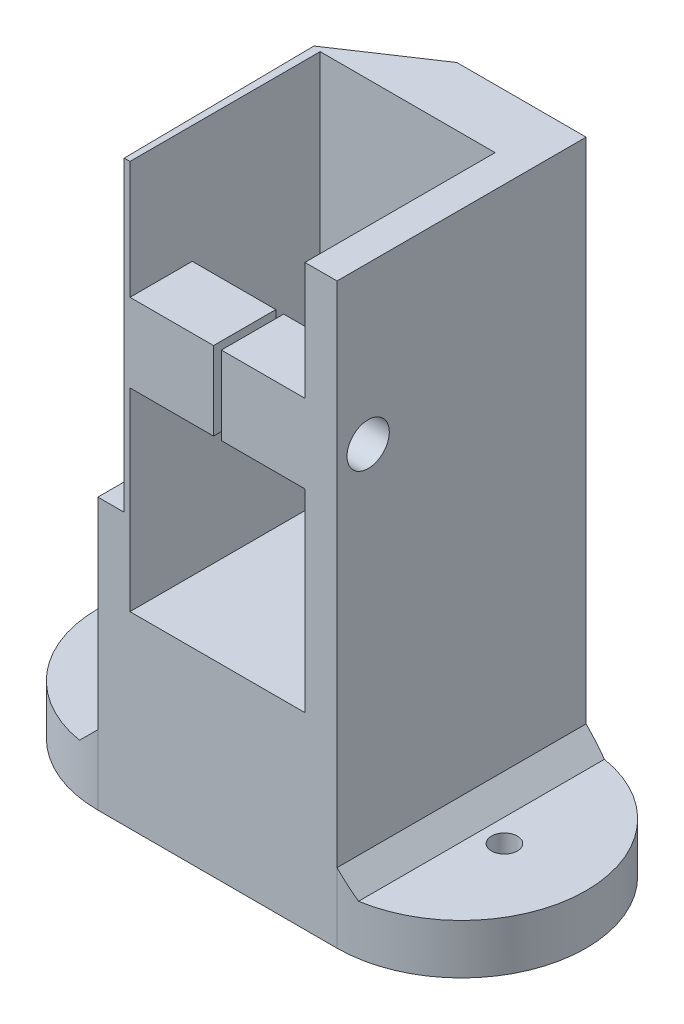
ISO-10303-21;
HEADER;
FILE_DESCRIPTION(('STEP AP214'),'2;1');
FILE_NAME('part.step','',(''),(''),'','','');
FILE_SCHEMA(('AUTOMOTIVE_DESIGN { 1 0 10303 214 1 1 1 1 }'));
ENDSEC;
DATA;
#1=APPLICATION_CONTEXT('core data for automotive mechanical design processes');
#2=APPLICATION_PROTOCOL_DEFINITION('international standard','automotive_design',2000,#1);
#3=PRODUCT_CONTEXT('',#1,'mechanical');
#4=PRODUCT('Part','Part','',(#3));
#5=PRODUCT_RELATED_PRODUCT_CATEGORY('part','',(#4));
#6=PRODUCT_DEFINITION_FORMATION('','',#4);
#7=PRODUCT_DEFINITION_CONTEXT('part definition',#1,'design');
#8=PRODUCT_DEFINITION('design','',#6,#7);
#9=PRODUCT_DEFINITION_SHAPE('','',#8);
#10=(LENGTH_UNIT() NAMED_UNIT(*) SI_UNIT(.MILLI.,.METRE.));
#11=(NAMED_UNIT(*) PLANE_ANGLE_UNIT() SI_UNIT($,.RADIAN.));
#12=(NAMED_UNIT(*) SI_UNIT($,.STERADIAN.) SOLID_ANGLE_UNIT());
#13=UNCERTAINTY_MEASURE_WITH_UNIT(LENGTH_MEASURE(1.E-05),#10,'distance_accuracy_value','');
#14=(GEOMETRIC_REPRESENTATION_CONTEXT(3) GLOBAL_UNCERTAINTY_ASSIGNED_CONTEXT((#13)) GLOBAL_UNIT_ASSIGNED_CONTEXT((#10,
#11,#12)) REPRESENTATION_CONTEXT('',''));
#15=CARTESIAN_POINT('',(0.,0.,0.));
#16=DIRECTION('',(0.,0.,1.));
#17=DIRECTION('',(1.,0.,0.));
#18=AXIS2_PLACEMENT_3D('',#15,#16,#17);
#19=CARTESIAN_POINT('',(0.,73.66,0.));
#20=DIRECTION('',(-1.,0.,0.));
#21=DIRECTION('',(0.,0.,1.));
#22=AXIS2_PLACEMENT_3D('',#19,#20,#21);
#23=PLANE('',#22);
#24=DIRECTION('',(0.,-1.,0.));
#25=VECTOR('',#24,1.);
#26=CARTESIAN_POINT('',(0.,73.66,0.));
#27=LINE('',#26,#25);
#28=CARTESIAN_POINT('',(0.,34.56,0.));
#29=VERTEX_POINT('',#28);
#30=CARTESIAN_POINT('',(0.,8.89,0.));
#31=VERTEX_POINT('',#30);
#32=EDGE_CURVE('E396',#29,#31,#27,.T.);
#33=ORIENTED_EDGE('',*,*,#32,.F.);
#34=DIRECTION('',(0.,0.,-1.));
#35=VECTOR('',#34,1.);
#36=CARTESIAN_POINT('',(0.,34.56,0.));
#37=LINE('',#36,#35);
#38=CARTESIAN_POINT('',(0.,34.56,-31.75));
#39=VERTEX_POINT('',#38);
#40=EDGE_CURVE('E11',#29,#39,#37,.T.);
#41=ORIENTED_EDGE('',*,*,#40,.T.);
#42=DIRECTION('',(0.,-1.,0.));
#43=VECTOR('',#42,1.);
#44=CARTESIAN_POINT('',(0.,73.66,-31.75));
#45=LINE('',#44,#43);
#46=CARTESIAN_POINT('',(0.,8.89,-31.75));
#47=VERTEX_POINT('',#46);
#48=EDGE_CURVE('E231',#39,#47,#45,.T.);
#49=ORIENTED_EDGE('',*,*,#48,.T.);
#50=DIRECTION('',(0.,0.,1.));
#51=VECTOR('',#50,1.);
#52=CARTESIAN_POINT('',(0.,8.89,0.));
#53=LINE('',#52,#51);
#54=EDGE_CURVE('E339',#47,#31,#53,.T.);
#55=ORIENTED_EDGE('',*,*,#54,.T.);
#56=EDGE_LOOP('',(#33,#41,#49,#55));
#57=FACE_BOUND('',#56,.T.);
#58=ADVANCED_FACE('F17',(#57),#23,.T.);
#59=CARTESIAN_POINT('',(0.,73.66,0.));
#60=DIRECTION('',(0.,1.,0.));
#61=DIRECTION('',(0.,0.,1.));
#62=AXIS2_PLACEMENT_3D('',#59,#60,#61);
#63=PLANE('',#62);
#64=DIRECTION('',(1.,0.,0.));
#65=VECTOR('',#64,1.);
#66=CARTESIAN_POINT('',(0.,73.66,-31.75));
#67=LINE('',#66,#65);
#68=CARTESIAN_POINT('',(14.0035822987556,73.66,-31.75));
#69=VERTEX_POINT('',#68);
#70=CARTESIAN_POINT('',(30.48,73.66,-31.75));
#71=VERTEX_POINT('',#70);
#72=EDGE_CURVE('E347',#69,#71,#67,.T.);
#73=ORIENTED_EDGE('',*,*,#72,.F.);
#74=DIRECTION('',(-0.832036943666449,0.,0.554720221710183));
#75=VECTOR('',#74,1.);
#76=CARTESIAN_POINT('',(8.53831481132242,73.66,-28.1062983405821));
#77=LINE('',#76,#75);
#78=CARTESIAN_POINT('',(3.0730473238892,73.66,-24.4625966811642));
#79=VERTEX_POINT('',#78);
#80=EDGE_CURVE('E215',#69,#79,#77,.T.);
#81=ORIENTED_EDGE('',*,*,#80,.T.);
#82=DIRECTION('',(-0.0116010565162885,0.,-0.999932705479577));
#83=VECTOR('',#82,1.);
#84=CARTESIAN_POINT('',(3.21495285667065,73.66,-12.2312983405821));
#85=LINE('',#84,#83);
#86=CARTESIAN_POINT('',(3.3568583894521,73.66,0.));
#87=VERTEX_POINT('',#86);
#88=EDGE_CURVE('E513',#87,#79,#85,.T.);
#89=ORIENTED_EDGE('',*,*,#88,.F.);
#90=DIRECTION('',(1.,0.,0.));
#91=VECTOR('',#90,1.);
#92=CARTESIAN_POINT('',(0.,73.66,0.));
#93=LINE('',#92,#91);
#94=CARTESIAN_POINT('',(4.09,73.66,0.));
#95=VERTEX_POINT('',#94);
#96=EDGE_CURVE('E399',#87,#95,#93,.T.);
#97=ORIENTED_EDGE('',*,*,#96,.T.);
#98=DIRECTION('',(0.,0.,1.));
#99=VECTOR('',#98,1.);
#100=CARTESIAN_POINT('',(4.09,73.66,-24.240000034));
#101=LINE('',#100,#99);
#102=CARTESIAN_POINT('',(4.09,73.66,-24.240000034));
#103=VERTEX_POINT('',#102);
#104=EDGE_CURVE('E476',#103,#95,#101,.T.);
#105=ORIENTED_EDGE('',*,*,#104,.F.);
#106=DIRECTION('',(-1.,0.,0.));
#107=VECTOR('',#106,1.);
#108=CARTESIAN_POINT('',(4.09,73.66,-24.240000034));
#109=LINE('',#108,#107);
#110=CARTESIAN_POINT('',(26.39,73.66,-24.240000034));
#111=VERTEX_POINT('',#110);
#112=EDGE_CURVE('E335',#111,#103,#109,.T.);
#113=ORIENTED_EDGE('',*,*,#112,.F.);
#114=DIRECTION('',(0.,0.,1.));
#115=VECTOR('',#114,1.);
#116=CARTESIAN_POINT('',(26.39,73.66,-24.240000034));
#117=LINE('',#116,#115);
#118=CARTESIAN_POINT('',(26.39,73.66,0.));
#119=VERTEX_POINT('',#118);
#120=EDGE_CURVE('E331',#111,#119,#117,.T.);
#121=ORIENTED_EDGE('',*,*,#120,.T.);
#122=CARTESIAN_POINT('',(30.48,73.66,0.));
#123=VERTEX_POINT('',#122);
#124=EDGE_CURVE('E392',#119,#123,#93,.T.);
#125=ORIENTED_EDGE('',*,*,#124,.T.);
#126=DIRECTION('',(0.,0.,-1.));
#127=VECTOR('',#126,1.);
#128=CARTESIAN_POINT('',(30.48,73.66,0.));
#129=LINE('',#128,#127);
#130=EDGE_CURVE('E356',#123,#71,#129,.T.);
#131=ORIENTED_EDGE('',*,*,#130,.T.);
#132=EDGE_LOOP('',(#73,#81,#89,#97,#105,#113,#121,#125,#131));
#133=FACE_BOUND('',#132,.T.);
#134=ADVANCED_FACE('F509',(#133),#63,.T.);
#135=CARTESIAN_POINT('',(4.09,73.66,-24.240000034));
#136=DIRECTION('',(-1.,0.,0.));
#137=DIRECTION('',(0.,-1.,0.));
#138=AXIS2_PLACEMENT_3D('',#135,#136,#137);
#139=PLANE('',#138);
#140=DIRECTION('',(0.,0.,-1.));
#141=VECTOR('',#140,1.);
#142=CARTESIAN_POINT('',(4.09,48.66,0.));
#143=LINE('',#142,#141);
#144=CARTESIAN_POINT('',(4.09,48.66,0.));
#145=VERTEX_POINT('',#144);
#146=CARTESIAN_POINT('',(4.09,48.66,-7.940000122));
#147=VERTEX_POINT('',#146);
#148=EDGE_CURVE('E25',#145,#147,#143,.T.);
#149=ORIENTED_EDGE('',*,*,#148,.F.);
#150=DIRECTION('',(0.,-1.,0.));
#151=VECTOR('',#150,1.);
#152=CARTESIAN_POINT('',(4.09,73.66,0.));
#153=LINE('',#152,#151);
#154=CARTESIAN_POINT('',(4.09,23.960000086,0.));
#155=VERTEX_POINT('',#154);
#156=EDGE_CURVE('E488',#145,#155,#153,.T.);
#157=ORIENTED_EDGE('',*,*,#156,.T.);
#158=DIRECTION('',(0.,0.,1.));
#159=VECTOR('',#158,1.);
#160=CARTESIAN_POINT('',(4.09,23.960000086,-24.240000034));
#161=LINE('',#160,#159);
#162=CARTESIAN_POINT('',(4.09,23.960000086,-24.240000034));
#163=VERTEX_POINT('',#162);
#164=EDGE_CURVE('E484',#163,#155,#161,.T.);
#165=ORIENTED_EDGE('',*,*,#164,.F.);
#166=DIRECTION('',(0.,-1.,0.));
#167=VECTOR('',#166,1.);
#168=CARTESIAN_POINT('',(4.09,73.66,-24.240000034));
#169=LINE('',#168,#167);
#170=EDGE_CURVE('E480',#103,#163,#169,.T.);
#171=ORIENTED_EDGE('',*,*,#170,.F.);
#172=ORIENTED_EDGE('',*,*,#104,.T.);
#173=CARTESIAN_POINT('',(4.09,58.66,0.));
#174=VERTEX_POINT('',#173);
#175=EDGE_CURVE('E475',#95,#174,#153,.T.);
#176=ORIENTED_EDGE('',*,*,#175,.T.);
#177=DIRECTION('',(0.,0.,1.));
#178=VECTOR('',#177,1.);
#179=CARTESIAN_POINT('',(4.09,58.66,0.));
#180=LINE('',#179,#178);
#181=CARTESIAN_POINT('',(4.09,58.66,-7.940000122));
#182=VERTEX_POINT('',#181);
#183=EDGE_CURVE('E471',#182,#174,#180,.T.);
#184=ORIENTED_EDGE('',*,*,#183,.F.);
#185=DIRECTION('',(0.,1.,0.));
#186=VECTOR('',#185,1.);
#187=CARTESIAN_POINT('',(4.09,58.66,-7.940000122));
#188=LINE('',#187,#186);
#189=EDGE_CURVE('E467',#147,#182,#188,.T.);
#190=ORIENTED_EDGE('',*,*,#189,.F.);
#191=EDGE_LOOP('',(#149,#157,#165,#171,#172,#176,#184,#190));
#192=FACE_BOUND('',#191,.T.);
#193=ADVANCED_FACE('F19',(#192),#139,.F.);
#194=CARTESIAN_POINT('',(0.,6.35,-15.875));
#195=DIRECTION('',(0.,-1.,0.));
#196=DIRECTION('',(0.,0.,-1.));
#197=AXIS2_PLACEMENT_3D('',#194,#195,#196);
#198=CYLINDRICAL_SURFACE('',#197,15.875);
#199=CARTESIAN_POINT('',(0.,0.,-15.875));
#200=DIRECTION('',(0.,1.,0.));
#201=DIRECTION('',(0.,0.,1.));
#202=AXIS2_PLACEMENT_3D('',#199,#200,#201);
#203=CIRCLE('',#202,15.875);
#204=CARTESIAN_POINT('',(0.,0.,0.));
#205=VERTEX_POINT('',#204);
#206=CARTESIAN_POINT('',(0.,0.,-31.75));
#207=VERTEX_POINT('',#206);
#208=EDGE_CURVE('E463',#205,#207,#203,.F.);
#209=ORIENTED_EDGE('',*,*,#208,.F.);
#210=DIRECTION('',(0.,-1.,0.));
#211=VECTOR('',#210,1.);
#212=CARTESIAN_POINT('',(0.,6.35,0.));
#213=LINE('',#212,#211);
#214=EDGE_CURVE('E459',#31,#205,#213,.T.);
#215=ORIENTED_EDGE('',*,*,#214,.F.);
#216=CARTESIAN_POINT('',(0.,8.89,-15.875));
#217=DIRECTION('',(-0.707106781186545,0.70710678118655,0.));
#218=DIRECTION('',(-0.70710678118655,-0.707106781186545,0.));
#219=AXIS2_PLACEMENT_3D('',#216,#217,#218);
#220=ELLIPSE('',#219,22.4506403026728,15.875);
#221=CARTESIAN_POINT('',(-2.54,6.35,-0.20451739734861));
#222=VERTEX_POINT('',#221);
#223=EDGE_CURVE('E456',#31,#222,#220,.F.);
#224=ORIENTED_EDGE('',*,*,#223,.T.);
#225=CARTESIAN_POINT('',(0.,6.35,-15.875));
#226=DIRECTION('',(0.,1.,0.));
#227=DIRECTION('',(0.,0.,1.));
#228=AXIS2_PLACEMENT_3D('',#225,#226,#227);
#229=CIRCLE('',#228,15.875);
#230=CARTESIAN_POINT('',(-2.54,6.35,-31.5454826026514));
#231=VERTEX_POINT('',#230);
#232=EDGE_CURVE('E453',#222,#231,#229,.F.);
#233=ORIENTED_EDGE('',*,*,#232,.T.);
#234=CARTESIAN_POINT('',(0.,8.89,-15.875));
#235=DIRECTION('',(-0.707106781186545,0.70710678118655,0.));
#236=DIRECTION('',(-0.70710678118655,-0.707106781186545,0.));
#237=AXIS2_PLACEMENT_3D('',#234,#235,#236);
#238=ELLIPSE('',#237,22.4506403026728,15.875);
#239=EDGE_CURVE('E449',#231,#47,#238,.F.);
#240=ORIENTED_EDGE('',*,*,#239,.T.);
#241=DIRECTION('',(0.,-1.,0.));
#242=VECTOR('',#241,1.);
#243=CARTESIAN_POINT('',(0.,6.35,-31.75));
#244=LINE('',#243,#242);
#245=EDGE_CURVE('E446',#47,#207,#244,.T.);
#246=ORIENTED_EDGE('',*,*,#245,.T.);
#247=EDGE_LOOP('',(#209,#215,#224,#233,#240,#246));
#248=FACE_BOUND('',#247,.T.);
#249=ADVANCED_FACE('F559',(#248),#198,.T.);
#250=CARTESIAN_POINT('',(-5.461,6.35,-15.875));
#251=DIRECTION('',(0.,-1.,0.));
#252=DIRECTION('',(0.,0.,-1.));
#253=AXIS2_PLACEMENT_3D('',#250,#251,#252);
#254=CYLINDRICAL_SURFACE('',#253,1.651);
#255=CARTESIAN_POINT('',(-5.461,6.35,-15.875));
#256=DIRECTION('',(0.,1.,0.));
#257=DIRECTION('',(0.,0.,1.));
#258=AXIS2_PLACEMENT_3D('',#255,#256,#257);
#259=CIRCLE('',#258,1.651);
#260=CARTESIAN_POINT('',(-5.461,6.35,-14.224));
#261=VERTEX_POINT('',#260);
#262=EDGE_CURVE('E442',#261,#261,#259,.T.);
#263=ORIENTED_EDGE('',*,*,#262,.T.);
#264=EDGE_LOOP('',(#263));
#265=FACE_BOUND('',#264,.T.);
#266=CARTESIAN_POINT('',(-5.461,0.,-15.875));
#267=DIRECTION('',(0.,1.,0.));
#268=DIRECTION('',(0.,0.,1.));
#269=AXIS2_PLACEMENT_3D('',#266,#267,#268);
#270=CIRCLE('',#269,1.651);
#271=CARTESIAN_POINT('',(-5.461,0.,-14.224));
#272=VERTEX_POINT('',#271);
#273=EDGE_CURVE('E438',#272,#272,#270,.T.);
#274=ORIENTED_EDGE('',*,*,#273,.F.);
#275=EDGE_LOOP('',(#274));
#276=FACE_BOUND('',#275,.T.);
#277=ADVANCED_FACE('F569',(#265,#276),#254,.F.);
#278=CARTESIAN_POINT('',(0.,6.35,0.));
#279=DIRECTION('',(0.,1.,0.));
#280=DIRECTION('',(0.,0.,1.));
#281=AXIS2_PLACEMENT_3D('',#278,#279,#280);
#282=PLANE('',#281);
#283=ORIENTED_EDGE('',*,*,#262,.F.);
#284=EDGE_LOOP('',(#283));
#285=FACE_BOUND('',#284,.T.);
#286=ORIENTED_EDGE('',*,*,#232,.F.);
#287=DIRECTION('',(0.,0.,-1.));
#288=VECTOR('',#287,1.);
#289=CARTESIAN_POINT('',(-2.54,6.35,-31.75));
#290=LINE('',#289,#288);
#291=EDGE_CURVE('E434',#222,#231,#290,.T.);
#292=ORIENTED_EDGE('',*,*,#291,.T.);
#293=EDGE_LOOP('',(#286,#292));
#294=FACE_BOUND('',#293,.T.);
#295=ADVANCED_FACE('F580',(#285,#294),#282,.T.);
#296=CARTESIAN_POINT('',(0.,0.,0.));
#297=DIRECTION('',(0.,1.,0.));
#298=DIRECTION('',(0.,0.,1.));
#299=AXIS2_PLACEMENT_3D('',#296,#297,#298);
#300=PLANE('',#299);
#301=ORIENTED_EDGE('',*,*,#273,.T.);
#302=EDGE_LOOP('',(#301));
#303=FACE_BOUND('',#302,.T.);
#304=ORIENTED_EDGE('',*,*,#208,.T.);
#305=DIRECTION('',(1.,0.,0.));
#306=VECTOR('',#305,1.);
#307=CARTESIAN_POINT('',(0.,0.,-31.75));
#308=LINE('',#307,#306);
#309=CARTESIAN_POINT('',(30.48,0.,-31.75));
#310=VERTEX_POINT('',#309);
#311=EDGE_CURVE('E431',#207,#310,#308,.T.);
#312=ORIENTED_EDGE('',*,*,#311,.T.);
#313=CARTESIAN_POINT('',(30.48,0.,-15.875));
#314=DIRECTION('',(0.,1.,0.));
#315=DIRECTION('',(0.,0.,1.));
#316=AXIS2_PLACEMENT_3D('',#313,#314,#315);
#317=CIRCLE('',#316,15.875);
#318=CARTESIAN_POINT('',(30.48,0.,0.));
#319=VERTEX_POINT('',#318);
#320=EDGE_CURVE('E427',#319,#310,#317,.T.);
#321=ORIENTED_EDGE('',*,*,#320,.F.);
#322=DIRECTION('',(1.,0.,0.));
#323=VECTOR('',#322,1.);
#324=CARTESIAN_POINT('',(0.,0.,0.));
#325=LINE('',#324,#323);
#326=EDGE_CURVE('E423',#205,#319,#325,.T.);
#327=ORIENTED_EDGE('',*,*,#326,.F.);
#328=EDGE_LOOP('',(#304,#312,#321,#327));
#329=FACE_BOUND('',#328,.T.);
#330=CARTESIAN_POINT('',(35.941,0.,-15.875));
#331=DIRECTION('',(0.,1.,0.));
#332=DIRECTION('',(0.,0.,1.));
#333=AXIS2_PLACEMENT_3D('',#330,#331,#332);
#334=CIRCLE('',#333,1.651);
#335=CARTESIAN_POINT('',(35.941,0.,-14.224));
#336=VERTEX_POINT('',#335);
#337=EDGE_CURVE('E419',#336,#336,#334,.T.);
#338=ORIENTED_EDGE('',*,*,#337,.T.);
#339=EDGE_LOOP('',(#338));
#340=FACE_BOUND('',#339,.T.);
#341=ADVANCED_FACE('F592',(#303,#329,#340),#300,.F.);
#342=CARTESIAN_POINT('',(0.,73.66,0.));
#343=DIRECTION('',(0.,0.,-1.));
#344=DIRECTION('',(-1.,0.,0.));
#345=AXIS2_PLACEMENT_3D('',#342,#343,#344);
#346=PLANE('',#345);
#347=ORIENTED_EDGE('',*,*,#96,.F.);
#348=DIRECTION('',(0.,1.,0.));
#349=VECTOR('',#348,1.);
#350=CARTESIAN_POINT('',(3.3568583894521,34.56,0.));
#351=LINE('',#350,#349);
#352=CARTESIAN_POINT('',(3.3568583894521,34.56,0.));
#353=VERTEX_POINT('',#352);
#354=EDGE_CURVE('E219',#353,#87,#351,.T.);
#355=ORIENTED_EDGE('',*,*,#354,.F.);
#356=DIRECTION('',(1.,0.,0.));
#357=VECTOR('',#356,1.);
#358=CARTESIAN_POINT('',(0.,34.56,0.));
#359=LINE('',#358,#357);
#360=EDGE_CURVE('E232',#29,#353,#359,.T.);
#361=ORIENTED_EDGE('',*,*,#360,.F.);
#362=ORIENTED_EDGE('',*,*,#32,.T.);
#363=ORIENTED_EDGE('',*,*,#214,.T.);
#364=ORIENTED_EDGE('',*,*,#326,.T.);
#365=DIRECTION('',(0.,-1.,0.));
#366=VECTOR('',#365,1.);
#367=CARTESIAN_POINT('',(30.48,6.35,0.));
#368=LINE('',#367,#366);
#369=CARTESIAN_POINT('',(30.48,8.89,0.));
#370=VERTEX_POINT('',#369);
#371=EDGE_CURVE('E391',#370,#319,#368,.T.);
#372=ORIENTED_EDGE('',*,*,#371,.F.);
#373=DIRECTION('',(0.,-1.,0.));
#374=VECTOR('',#373,1.);
#375=CARTESIAN_POINT('',(30.48,73.66,0.));
#376=LINE('',#375,#374);
#377=EDGE_CURVE('E387',#123,#370,#376,.T.);
#378=ORIENTED_EDGE('',*,*,#377,.F.);
#379=ORIENTED_EDGE('',*,*,#124,.F.);
#380=DIRECTION('',(0.,1.,0.));
#381=VECTOR('',#380,1.);
#382=CARTESIAN_POINT('',(26.39,73.66,0.));
#383=LINE('',#382,#381);
#384=CARTESIAN_POINT('',(26.39,58.66,0.));
#385=VERTEX_POINT('',#384);
#386=EDGE_CURVE('E383',#385,#119,#383,.T.);
#387=ORIENTED_EDGE('',*,*,#386,.F.);
#388=DIRECTION('',(1.,0.,0.));
#389=VECTOR('',#388,1.);
#390=CARTESIAN_POINT('',(2.47114719572036,58.66,0.));
#391=LINE('',#390,#389);
#392=CARTESIAN_POINT('',(15.74,58.66,0.));
#393=VERTEX_POINT('',#392);
#394=EDGE_CURVE('E379',#393,#385,#391,.T.);
#395=ORIENTED_EDGE('',*,*,#394,.F.);
#396=DIRECTION('',(0.,1.,0.));
#397=VECTOR('',#396,1.);
#398=CARTESIAN_POINT('',(15.74,58.66,0.));
#399=LINE('',#398,#397);
#400=CARTESIAN_POINT('',(15.74,48.66,0.));
#401=VERTEX_POINT('',#400);
#402=EDGE_CURVE('E375',#401,#393,#399,.T.);
#403=ORIENTED_EDGE('',*,*,#402,.F.);
#404=DIRECTION('',(1.,0.,0.));
#405=VECTOR('',#404,1.);
#406=CARTESIAN_POINT('',(2.47114719572036,48.66,0.));
#407=LINE('',#406,#405);
#408=CARTESIAN_POINT('',(26.39,48.66,0.));
#409=VERTEX_POINT('',#408);
#410=EDGE_CURVE('E372',#401,#409,#407,.T.);
#411=ORIENTED_EDGE('',*,*,#410,.T.);
#412=CARTESIAN_POINT('',(26.39,23.960000086,0.));
#413=VERTEX_POINT('',#412);
#414=EDGE_CURVE('E371',#413,#409,#383,.T.);
#415=ORIENTED_EDGE('',*,*,#414,.F.);
#416=DIRECTION('',(1.,0.,0.));
#417=VECTOR('',#416,1.);
#418=CARTESIAN_POINT('',(4.09,23.960000086,0.));
#419=LINE('',#418,#417);
#420=EDGE_CURVE('E415',#155,#413,#419,.T.);
#421=ORIENTED_EDGE('',*,*,#420,.F.);
#422=ORIENTED_EDGE('',*,*,#156,.F.);
#423=DIRECTION('',(-1.,0.,0.));
#424=VECTOR('',#423,1.);
#425=CARTESIAN_POINT('',(28.0088528042796,48.66,0.));
#426=LINE('',#425,#424);
#427=CARTESIAN_POINT('',(14.74,48.66,0.));
#428=VERTEX_POINT('',#427);
#429=EDGE_CURVE('E411',#428,#145,#426,.T.);
#430=ORIENTED_EDGE('',*,*,#429,.F.);
#431=DIRECTION('',(0.,-1.,0.));
#432=VECTOR('',#431,1.);
#433=CARTESIAN_POINT('',(14.74,58.66,0.));
#434=LINE('',#433,#432);
#435=CARTESIAN_POINT('',(14.74,58.66,0.));
#436=VERTEX_POINT('',#435);
#437=EDGE_CURVE('E407',#436,#428,#434,.T.);
#438=ORIENTED_EDGE('',*,*,#437,.F.);
#439=DIRECTION('',(-1.,0.,0.));
#440=VECTOR('',#439,1.);
#441=CARTESIAN_POINT('',(28.0088528042796,58.66,0.));
#442=LINE('',#441,#440);
#443=EDGE_CURVE('E403',#436,#174,#442,.T.);
#444=ORIENTED_EDGE('',*,*,#443,.T.);
#445=ORIENTED_EDGE('',*,*,#175,.F.);
#446=EDGE_LOOP('',(#347,#355,#361,#362,#363,#364,#372,#378,#379,#387,#395,#403,#411,#415,#421,
#422,#430,#438,#444,#445));
#447=FACE_BOUND('',#446,.T.);
#448=ADVANCED_FACE('F500',(#447),#346,.F.);
#449=CARTESIAN_POINT('',(30.48,73.66,0.));
#450=DIRECTION('',(-1.,0.,0.));
#451=DIRECTION('',(0.,0.,1.));
#452=AXIS2_PLACEMENT_3D('',#449,#450,#451);
#453=PLANE('',#452);
#454=CARTESIAN_POINT('',(30.48,53.66,-3.970000061));
#455=DIRECTION('',(-1.,0.,0.));
#456=DIRECTION('',(0.,0.,1.));
#457=AXIS2_PLACEMENT_3D('',#454,#455,#456);
#458=CIRCLE('',#457,2.694750008);
#459=CARTESIAN_POINT('',(30.48,53.66,-1.275250053));
#460=VERTEX_POINT('',#459);
#461=EDGE_CURVE('E367',#460,#460,#458,.T.);
#462=ORIENTED_EDGE('',*,*,#461,.T.);
#463=EDGE_LOOP('',(#462));
#464=FACE_BOUND('',#463,.T.);
#465=ORIENTED_EDGE('',*,*,#377,.T.);
#466=DIRECTION('',(0.,0.,-1.));
#467=VECTOR('',#466,1.);
#468=CARTESIAN_POINT('',(30.48,8.89,0.));
#469=LINE('',#468,#467);
#470=CARTESIAN_POINT('',(30.48,8.89,-31.75));
#471=VERTEX_POINT('',#470);
#472=EDGE_CURVE('E364',#370,#471,#469,.T.);
#473=ORIENTED_EDGE('',*,*,#472,.T.);
#474=DIRECTION('',(0.,-1.,0.));
#475=VECTOR('',#474,1.);
#476=CARTESIAN_POINT('',(30.48,73.66,-31.75));
#477=LINE('',#476,#475);
#478=EDGE_CURVE('E360',#71,#471,#477,.T.);
#479=ORIENTED_EDGE('',*,*,#478,.F.);
#480=ORIENTED_EDGE('',*,*,#130,.F.);
#481=EDGE_LOOP('',(#465,#473,#479,#480));
#482=FACE_BOUND('',#481,.T.);
#483=ADVANCED_FACE('F615',(#464,#482),#453,.F.);
#484=CARTESIAN_POINT('',(0.,73.66,-31.75));
#485=DIRECTION('',(0.,0.,-1.));
#486=DIRECTION('',(-1.,0.,0.));
#487=AXIS2_PLACEMENT_3D('',#484,#485,#486);
#488=PLANE('',#487);
#489=DIRECTION('',(0.,1.,0.));
#490=VECTOR('',#489,1.);
#491=CARTESIAN_POINT('',(14.0035822987556,34.56,-31.75));
#492=LINE('',#491,#490);
#493=CARTESIAN_POINT('',(14.0035822987556,34.56,-31.75));
#494=VERTEX_POINT('',#493);
#495=EDGE_CURVE('E211',#494,#69,#492,.T.);
#496=ORIENTED_EDGE('',*,*,#495,.T.);
#497=ORIENTED_EDGE('',*,*,#72,.T.);
#498=ORIENTED_EDGE('',*,*,#478,.T.);
#499=DIRECTION('',(0.,-1.,0.));
#500=VECTOR('',#499,1.);
#501=CARTESIAN_POINT('',(30.48,6.35,-31.75));
#502=LINE('',#501,#500);
#503=EDGE_CURVE('E343',#471,#310,#502,.T.);
#504=ORIENTED_EDGE('',*,*,#503,.T.);
#505=ORIENTED_EDGE('',*,*,#311,.F.);
#506=ORIENTED_EDGE('',*,*,#245,.F.);
#507=ORIENTED_EDGE('',*,*,#48,.F.);
#508=DIRECTION('',(1.,0.,0.));
#509=VECTOR('',#508,1.);
#510=CARTESIAN_POINT('',(0.,34.56,-31.75));
#511=LINE('',#510,#509);
#512=EDGE_CURVE('E32',#39,#494,#511,.T.);
#513=ORIENTED_EDGE('',*,*,#512,.T.);
#514=EDGE_LOOP('',(#496,#497,#498,#504,#505,#506,#507,#513));
#515=FACE_BOUND('',#514,.T.);
#516=CARTESIAN_POINT('',(15.24,28.370000086,-31.75));
#517=DIRECTION('',(0.,0.,-1.));
#518=DIRECTION('',(-1.,0.,0.));
#519=AXIS2_PLACEMENT_3D('',#516,#517,#518);
#520=CIRCLE('',#519,2.99085);
#521=CARTESIAN_POINT('',(12.24915,28.370000086,-31.75));
#522=VERTEX_POINT('',#521);
#523=EDGE_CURVE('E352',#522,#522,#520,.T.);
#524=ORIENTED_EDGE('',*,*,#523,.F.);
#525=EDGE_LOOP('',(#524));
#526=FACE_BOUND('',#525,.T.);
#527=ADVANCED_FACE('F228',(#515,#526),#488,.T.);
#528=CARTESIAN_POINT('',(35.941,6.35,-15.875));
#529=DIRECTION('',(0.,-1.,0.));
#530=DIRECTION('',(0.,0.,-1.));
#531=AXIS2_PLACEMENT_3D('',#528,#529,#530);
#532=CYLINDRICAL_SURFACE('',#531,1.651);
#533=CARTESIAN_POINT('',(35.941,6.35,-15.875));
#534=DIRECTION('',(0.,1.,0.));
#535=DIRECTION('',(0.,0.,1.));
#536=AXIS2_PLACEMENT_3D('',#533,#534,#535);
#537=CIRCLE('',#536,1.651);
#538=CARTESIAN_POINT('',(35.941,6.35,-14.224));
#539=VERTEX_POINT('',#538);
#540=EDGE_CURVE('E327',#539,#539,#537,.T.);
#541=ORIENTED_EDGE('',*,*,#540,.T.);
#542=EDGE_LOOP('',(#541));
#543=FACE_BOUND('',#542,.T.);
#544=ORIENTED_EDGE('',*,*,#337,.F.);
#545=EDGE_LOOP('',(#544));
#546=FACE_BOUND('',#545,.T.);
#547=ADVANCED_FACE('F637',(#543,#546),#532,.F.);
#548=CARTESIAN_POINT('',(30.48,6.35,-15.875));
#549=DIRECTION('',(0.,-1.,0.));
#550=DIRECTION('',(0.,0.,-1.));
#551=AXIS2_PLACEMENT_3D('',#548,#549,#550);
#552=CYLINDRICAL_SURFACE('',#551,15.875);
#553=ORIENTED_EDGE('',*,*,#320,.T.);
#554=ORIENTED_EDGE('',*,*,#503,.F.);
#555=CARTESIAN_POINT('',(30.48,8.89,-15.875));
#556=DIRECTION('',(-0.707106781186549,-0.707106781186546,0.));
#557=DIRECTION('',(0.707106781186546,-0.707106781186549,0.));
#558=AXIS2_PLACEMENT_3D('',#555,#556,#557);
#559=ELLIPSE('',#558,22.4506403026729,15.875);
#560=CARTESIAN_POINT('',(33.02,6.35,-31.5454826026514));
#561=VERTEX_POINT('',#560);
#562=EDGE_CURVE('E324',#471,#561,#559,.T.);
#563=ORIENTED_EDGE('',*,*,#562,.T.);
#564=CARTESIAN_POINT('',(30.48,6.35,-15.875));
#565=DIRECTION('',(0.,1.,0.));
#566=DIRECTION('',(0.,0.,1.));
#567=AXIS2_PLACEMENT_3D('',#564,#565,#566);
#568=CIRCLE('',#567,15.875);
#569=CARTESIAN_POINT('',(33.02,6.35,-0.204517397348607));
#570=VERTEX_POINT('',#569);
#571=EDGE_CURVE('E320',#570,#561,#568,.T.);
#572=ORIENTED_EDGE('',*,*,#571,.F.);
#573=CARTESIAN_POINT('',(30.48,8.89,-15.875));
#574=DIRECTION('',(-0.707106781186549,-0.707106781186546,0.));
#575=DIRECTION('',(0.707106781186546,-0.707106781186549,0.));
#576=AXIS2_PLACEMENT_3D('',#573,#574,#575);
#577=ELLIPSE('',#576,22.4506403026729,15.875);
#578=EDGE_CURVE('E316',#570,#370,#577,.T.);
#579=ORIENTED_EDGE('',*,*,#578,.T.);
#580=ORIENTED_EDGE('',*,*,#371,.T.);
#581=EDGE_LOOP('',(#553,#554,#563,#572,#579,#580));
#582=FACE_BOUND('',#581,.T.);
#583=ADVANCED_FACE('F648',(#582),#552,.T.);
#584=CARTESIAN_POINT('',(0.,6.35,0.));
#585=DIRECTION('',(0.,1.,0.));
#586=DIRECTION('',(0.,0.,1.));
#587=AXIS2_PLACEMENT_3D('',#584,#585,#586);
#588=PLANE('',#587);
#589=ORIENTED_EDGE('',*,*,#540,.F.);
#590=EDGE_LOOP('',(#589));
#591=FACE_BOUND('',#590,.T.);
#592=ORIENTED_EDGE('',*,*,#571,.T.);
#593=DIRECTION('',(0.,0.,1.));
#594=VECTOR('',#593,1.);
#595=CARTESIAN_POINT('',(33.02,6.35,0.));
#596=LINE('',#595,#594);
#597=EDGE_CURVE('E312',#561,#570,#596,.T.);
#598=ORIENTED_EDGE('',*,*,#597,.T.);
#599=EDGE_LOOP('',(#592,#598));
#600=FACE_BOUND('',#599,.T.);
#601=ADVANCED_FACE('F660',(#591,#600),#588,.T.);
#602=CARTESIAN_POINT('',(26.39,73.66,-24.240000034));
#603=DIRECTION('',(1.,0.,0.));
#604=DIRECTION('',(0.,0.,-1.));
#605=AXIS2_PLACEMENT_3D('',#602,#603,#604);
#606=PLANE('',#605);
#607=DIRECTION('',(0.,1.,0.));
#608=VECTOR('',#607,1.);
#609=CARTESIAN_POINT('',(26.39,58.66,-7.940000122));
#610=LINE('',#609,#608);
#611=CARTESIAN_POINT('',(26.39,48.66,-7.940000122));
#612=VERTEX_POINT('',#611);
#613=CARTESIAN_POINT('',(26.39,58.66,-7.940000122));
#614=VERTEX_POINT('',#613);
#615=EDGE_CURVE('E309',#612,#614,#610,.T.);
#616=ORIENTED_EDGE('',*,*,#615,.T.);
#617=DIRECTION('',(0.,0.,1.));
#618=VECTOR('',#617,1.);
#619=CARTESIAN_POINT('',(26.39,58.66,0.));
#620=LINE('',#619,#618);
#621=EDGE_CURVE('E305',#614,#385,#620,.T.);
#622=ORIENTED_EDGE('',*,*,#621,.T.);
#623=ORIENTED_EDGE('',*,*,#386,.T.);
#624=ORIENTED_EDGE('',*,*,#120,.F.);
#625=DIRECTION('',(0.,1.,0.));
#626=VECTOR('',#625,1.);
#627=CARTESIAN_POINT('',(26.39,73.66,-24.240000034));
#628=LINE('',#627,#626);
#629=CARTESIAN_POINT('',(26.39,23.960000086,-24.240000034));
#630=VERTEX_POINT('',#629);
#631=EDGE_CURVE('E301',#630,#111,#628,.T.);
#632=ORIENTED_EDGE('',*,*,#631,.F.);
#633=DIRECTION('',(0.,0.,1.));
#634=VECTOR('',#633,1.);
#635=CARTESIAN_POINT('',(26.39,23.960000086,-24.240000034));
#636=LINE('',#635,#634);
#637=EDGE_CURVE('E297',#630,#413,#636,.T.);
#638=ORIENTED_EDGE('',*,*,#637,.T.);
#639=ORIENTED_EDGE('',*,*,#414,.T.);
#640=DIRECTION('',(0.,0.,-1.));
#641=VECTOR('',#640,1.);
#642=CARTESIAN_POINT('',(26.39,48.66,0.));
#643=LINE('',#642,#641);
#644=EDGE_CURVE('E294',#409,#612,#643,.T.);
#645=ORIENTED_EDGE('',*,*,#644,.T.);
#646=EDGE_LOOP('',(#616,#622,#623,#624,#632,#638,#639,#645));
#647=FACE_BOUND('',#646,.T.);
#648=ADVANCED_FACE('F672',(#647),#606,.F.);
#649=CARTESIAN_POINT('',(4.09,23.960000086,-24.240000034));
#650=DIRECTION('',(0.,-1.,0.));
#651=DIRECTION('',(0.,0.,-1.));
#652=AXIS2_PLACEMENT_3D('',#649,#650,#651);
#653=PLANE('',#652);
#654=ORIENTED_EDGE('',*,*,#420,.T.);
#655=ORIENTED_EDGE('',*,*,#637,.F.);
#656=DIRECTION('',(1.,0.,0.));
#657=VECTOR('',#656,1.);
#658=CARTESIAN_POINT('',(4.09,23.960000086,-24.240000034));
#659=LINE('',#658,#657);
#660=EDGE_CURVE('E290',#163,#630,#659,.T.);
#661=ORIENTED_EDGE('',*,*,#660,.F.);
#662=ORIENTED_EDGE('',*,*,#164,.T.);
#663=EDGE_LOOP('',(#654,#655,#661,#662));
#664=FACE_BOUND('',#663,.T.);
#665=ADVANCED_FACE('F503',(#664),#653,.F.);
#666=CARTESIAN_POINT('',(0.,0.,-24.240000034));
#667=DIRECTION('',(0.,0.,1.));
#668=DIRECTION('',(1.,0.,0.));
#669=AXIS2_PLACEMENT_3D('',#666,#667,#668);
#670=PLANE('',#669);
#671=CARTESIAN_POINT('',(15.24,28.370000086,-24.240000034));
#672=DIRECTION('',(0.,0.,1.));
#673=DIRECTION('',(1.,0.,0.));
#674=AXIS2_PLACEMENT_3D('',#671,#672,#673);
#675=CIRCLE('',#674,2.99085);
#676=CARTESIAN_POINT('',(18.23085,28.370000086,-24.240000034));
#677=VERTEX_POINT('',#676);
#678=EDGE_CURVE('E286',#677,#677,#675,.T.);
#679=ORIENTED_EDGE('',*,*,#678,.F.);
#680=EDGE_LOOP('',(#679));
#681=FACE_BOUND('',#680,.T.);
#682=ORIENTED_EDGE('',*,*,#170,.T.);
#683=ORIENTED_EDGE('',*,*,#660,.T.);
#684=ORIENTED_EDGE('',*,*,#631,.T.);
#685=ORIENTED_EDGE('',*,*,#112,.T.);
#686=EDGE_LOOP('',(#682,#683,#684,#685));
#687=FACE_BOUND('',#686,.T.);
#688=ADVANCED_FACE('F505',(#681,#687),#670,.T.);
#689=CARTESIAN_POINT('',(15.24,28.370000086,-34.400000034));
#690=DIRECTION('',(0.,0.,1.));
#691=DIRECTION('',(1.,0.,0.));
#692=AXIS2_PLACEMENT_3D('',#689,#690,#691);
#693=CYLINDRICAL_SURFACE('',#692,2.99085);
#694=ORIENTED_EDGE('',*,*,#523,.T.);
#695=EDGE_LOOP('',(#694));
#696=FACE_BOUND('',#695,.T.);
#697=ORIENTED_EDGE('',*,*,#678,.T.);
#698=EDGE_LOOP('',(#697));
#699=FACE_BOUND('',#698,.T.);
#700=ADVANCED_FACE('F705',(#696,#699),#693,.F.);
#701=CARTESIAN_POINT('',(30.48,8.89,0.));
#702=DIRECTION('',(-0.707106781186549,-0.707106781186546,0.));
#703=DIRECTION('',(0.,0.,-1.));
#704=AXIS2_PLACEMENT_3D('',#701,#702,#703);
#705=PLANE('',#704);
#706=ORIENTED_EDGE('',*,*,#578,.F.);
#707=ORIENTED_EDGE('',*,*,#597,.F.);
#708=ORIENTED_EDGE('',*,*,#562,.F.);
#709=ORIENTED_EDGE('',*,*,#472,.F.);
#710=EDGE_LOOP('',(#706,#707,#708,#709));
#711=FACE_BOUND('',#710,.T.);
#712=ADVANCED_FACE('F717',(#711),#705,.F.);
#713=CARTESIAN_POINT('',(-2.54,6.35,0.));
#714=DIRECTION('',(-0.707106781186545,0.70710678118655,0.));
#715=DIRECTION('',(0.,0.,1.));
#716=AXIS2_PLACEMENT_3D('',#713,#714,#715);
#717=PLANE('',#716);
#718=ORIENTED_EDGE('',*,*,#223,.F.);
#719=ORIENTED_EDGE('',*,*,#54,.F.);
#720=ORIENTED_EDGE('',*,*,#239,.F.);
#721=ORIENTED_EDGE('',*,*,#291,.F.);
#722=EDGE_LOOP('',(#718,#719,#720,#721));
#723=FACE_BOUND('',#722,.T.);
#724=ADVANCED_FACE('F729',(#723),#717,.T.);
#725=CARTESIAN_POINT('',(28.0088528042796,48.66,0.));
#726=DIRECTION('',(0.,1.,0.));
#727=DIRECTION('',(-1.,0.,0.));
#728=AXIS2_PLACEMENT_3D('',#725,#726,#727);
#729=PLANE('',#728);
#730=DIRECTION('',(0.,0.,-1.));
#731=VECTOR('',#730,1.);
#732=CARTESIAN_POINT('',(14.74,48.66,0.));
#733=LINE('',#732,#731);
#734=CARTESIAN_POINT('',(14.74,48.66,-7.940000122));
#735=VERTEX_POINT('',#734);
#736=EDGE_CURVE('E282',#428,#735,#733,.T.);
#737=ORIENTED_EDGE('',*,*,#736,.F.);
#738=ORIENTED_EDGE('',*,*,#429,.T.);
#739=ORIENTED_EDGE('',*,*,#148,.T.);
#740=DIRECTION('',(-1.,0.,0.));
#741=VECTOR('',#740,1.);
#742=CARTESIAN_POINT('',(28.0088528042796,48.66,-7.940000122));
#743=LINE('',#742,#741);
#744=EDGE_CURVE('E278',#735,#147,#743,.T.);
#745=ORIENTED_EDGE('',*,*,#744,.F.);
#746=EDGE_LOOP('',(#737,#738,#739,#745));
#747=FACE_BOUND('',#746,.T.);
#748=ADVANCED_FACE('F741',(#747),#729,.F.);
#749=CARTESIAN_POINT('',(28.0088528042796,58.66,-7.940000122));
#750=DIRECTION('',(0.,0.,1.));
#751=DIRECTION('',(1.,0.,0.));
#752=AXIS2_PLACEMENT_3D('',#749,#750,#751);
#753=PLANE('',#752);
#754=DIRECTION('',(0.,1.,0.));
#755=VECTOR('',#754,1.);
#756=CARTESIAN_POINT('',(14.74,58.66,-7.940000122));
#757=LINE('',#756,#755);
#758=CARTESIAN_POINT('',(14.74,58.66,-7.940000122));
#759=VERTEX_POINT('',#758);
#760=EDGE_CURVE('E274',#735,#759,#757,.T.);
#761=ORIENTED_EDGE('',*,*,#760,.F.);
#762=ORIENTED_EDGE('',*,*,#744,.T.);
#763=ORIENTED_EDGE('',*,*,#189,.T.);
#764=DIRECTION('',(-1.,0.,0.));
#765=VECTOR('',#764,1.);
#766=CARTESIAN_POINT('',(28.0088528042796,58.66,-7.940000122));
#767=LINE('',#766,#765);
#768=EDGE_CURVE('E270',#759,#182,#767,.T.);
#769=ORIENTED_EDGE('',*,*,#768,.F.);
#770=EDGE_LOOP('',(#761,#762,#763,#769));
#771=FACE_BOUND('',#770,.T.);
#772=ADVANCED_FACE('F753',(#771),#753,.F.);
#773=CARTESIAN_POINT('',(28.0088528042796,58.66,0.));
#774=DIRECTION('',(0.,-1.,0.));
#775=DIRECTION('',(1.,0.,0.));
#776=AXIS2_PLACEMENT_3D('',#773,#774,#775);
#777=PLANE('',#776);
#778=DIRECTION('',(0.,0.,1.));
#779=VECTOR('',#778,1.);
#780=CARTESIAN_POINT('',(14.74,58.66,0.));
#781=LINE('',#780,#779);
#782=EDGE_CURVE('E266',#759,#436,#781,.T.);
#783=ORIENTED_EDGE('',*,*,#782,.F.);
#784=ORIENTED_EDGE('',*,*,#768,.T.);
#785=ORIENTED_EDGE('',*,*,#183,.T.);
#786=ORIENTED_EDGE('',*,*,#443,.F.);
#787=EDGE_LOOP('',(#783,#784,#785,#786));
#788=FACE_BOUND('',#787,.T.);
#789=ADVANCED_FACE('F764',(#788),#777,.F.);
#790=CARTESIAN_POINT('',(14.74,0.,0.));
#791=DIRECTION('',(1.,0.,0.));
#792=DIRECTION('',(0.,1.,0.));
#793=AXIS2_PLACEMENT_3D('',#790,#791,#792);
#794=PLANE('',#793);
#795=CARTESIAN_POINT('',(14.74,53.66,-3.970000061));
#796=DIRECTION('',(1.,0.,0.));
#797=DIRECTION('',(0.,1.,0.));
#798=AXIS2_PLACEMENT_3D('',#795,#796,#797);
#799=CIRCLE('',#798,2.694750008);
#800=CARTESIAN_POINT('',(14.74,56.354750008,-3.970000061));
#801=VERTEX_POINT('',#800);
#802=EDGE_CURVE('E262',#801,#801,#799,.T.);
#803=ORIENTED_EDGE('',*,*,#802,.F.);
#804=EDGE_LOOP('',(#803));
#805=FACE_BOUND('',#804,.T.);
#806=ORIENTED_EDGE('',*,*,#782,.T.);
#807=ORIENTED_EDGE('',*,*,#437,.T.);
#808=ORIENTED_EDGE('',*,*,#736,.T.);
#809=ORIENTED_EDGE('',*,*,#760,.T.);
#810=EDGE_LOOP('',(#806,#807,#808,#809));
#811=FACE_BOUND('',#810,.T.);
#812=ADVANCED_FACE('F776',(#805,#811),#794,.T.);
#813=CARTESIAN_POINT('',(2.47114719572036,58.66,0.));
#814=DIRECTION('',(0.,1.,0.));
#815=DIRECTION('',(0.,0.,1.));
#816=AXIS2_PLACEMENT_3D('',#813,#814,#815);
#817=PLANE('',#816);
#818=DIRECTION('',(0.,0.,-1.));
#819=VECTOR('',#818,1.);
#820=CARTESIAN_POINT('',(15.74,58.66,0.));
#821=LINE('',#820,#819);
#822=CARTESIAN_POINT('',(15.74,58.66,-7.940000122));
#823=VERTEX_POINT('',#822);
#824=EDGE_CURVE('E258',#393,#823,#821,.T.);
#825=ORIENTED_EDGE('',*,*,#824,.F.);
#826=ORIENTED_EDGE('',*,*,#394,.T.);
#827=ORIENTED_EDGE('',*,*,#621,.F.);
#828=DIRECTION('',(1.,0.,0.));
#829=VECTOR('',#828,1.);
#830=CARTESIAN_POINT('',(2.47114719572036,58.66,-7.940000122));
#831=LINE('',#830,#829);
#832=EDGE_CURVE('E254',#823,#614,#831,.T.);
#833=ORIENTED_EDGE('',*,*,#832,.F.);
#834=EDGE_LOOP('',(#825,#826,#827,#833));
#835=FACE_BOUND('',#834,.T.);
#836=ADVANCED_FACE('F788',(#835),#817,.T.);
#837=CARTESIAN_POINT('',(2.47114719572036,58.66,-7.940000122));
#838=DIRECTION('',(0.,0.,-1.));
#839=DIRECTION('',(-1.,0.,0.));
#840=AXIS2_PLACEMENT_3D('',#837,#838,#839);
#841=PLANE('',#840);
#842=DIRECTION('',(0.,-1.,0.));
#843=VECTOR('',#842,1.);
#844=CARTESIAN_POINT('',(15.74,58.66,-7.940000122));
#845=LINE('',#844,#843);
#846=CARTESIAN_POINT('',(15.74,48.66,-7.940000122));
#847=VERTEX_POINT('',#846);
#848=EDGE_CURVE('E250',#823,#847,#845,.T.);
#849=ORIENTED_EDGE('',*,*,#848,.F.);
#850=ORIENTED_EDGE('',*,*,#832,.T.);
#851=ORIENTED_EDGE('',*,*,#615,.F.);
#852=DIRECTION('',(1.,0.,0.));
#853=VECTOR('',#852,1.);
#854=CARTESIAN_POINT('',(2.47114719572036,48.66,-7.940000122));
#855=LINE('',#854,#853);
#856=EDGE_CURVE('E246',#847,#612,#855,.T.);
#857=ORIENTED_EDGE('',*,*,#856,.F.);
#858=EDGE_LOOP('',(#849,#850,#851,#857));
#859=FACE_BOUND('',#858,.T.);
#860=ADVANCED_FACE('F800',(#859),#841,.T.);
#861=CARTESIAN_POINT('',(2.47114719572036,48.66,0.));
#862=DIRECTION('',(0.,-1.,0.));
#863=DIRECTION('',(0.,0.,-1.));
#864=AXIS2_PLACEMENT_3D('',#861,#862,#863);
#865=PLANE('',#864);
#866=DIRECTION('',(0.,0.,1.));
#867=VECTOR('',#866,1.);
#868=CARTESIAN_POINT('',(15.74,48.66,0.));
#869=LINE('',#868,#867);
#870=EDGE_CURVE('E242',#847,#401,#869,.T.);
#871=ORIENTED_EDGE('',*,*,#870,.F.);
#872=ORIENTED_EDGE('',*,*,#856,.T.);
#873=ORIENTED_EDGE('',*,*,#644,.F.);
#874=ORIENTED_EDGE('',*,*,#410,.F.);
#875=EDGE_LOOP('',(#871,#872,#873,#874));
#876=FACE_BOUND('',#875,.T.);
#877=ADVANCED_FACE('F812',(#876),#865,.T.);
#878=CARTESIAN_POINT('',(15.74,0.,0.));
#879=DIRECTION('',(1.,0.,0.));
#880=DIRECTION('',(0.,1.,0.));
#881=AXIS2_PLACEMENT_3D('',#878,#879,#880);
#882=PLANE('',#881);
#883=CARTESIAN_POINT('',(15.74,53.66,-3.970000061));
#884=DIRECTION('',(1.,0.,0.));
#885=DIRECTION('',(0.,1.,0.));
#886=AXIS2_PLACEMENT_3D('',#883,#884,#885);
#887=CIRCLE('',#886,2.694750008);
#888=CARTESIAN_POINT('',(15.74,56.354750008,-3.970000061));
#889=VERTEX_POINT('',#888);
#890=EDGE_CURVE('E234',#889,#889,#887,.T.);
#891=ORIENTED_EDGE('',*,*,#890,.T.);
#892=EDGE_LOOP('',(#891));
#893=FACE_BOUND('',#892,.T.);
#894=ORIENTED_EDGE('',*,*,#402,.T.);
#895=ORIENTED_EDGE('',*,*,#824,.T.);
#896=ORIENTED_EDGE('',*,*,#848,.T.);
#897=ORIENTED_EDGE('',*,*,#870,.T.);
#898=EDGE_LOOP('',(#894,#895,#896,#897));
#899=FACE_BOUND('',#898,.T.);
#900=ADVANCED_FACE('F824',(#893,#899),#882,.F.);
#901=CARTESIAN_POINT('',(-15.875,53.66,-3.970000061));
#902=DIRECTION('',(1.,0.,0.));
#903=DIRECTION('',(0.,1.,0.));
#904=AXIS2_PLACEMENT_3D('',#901,#902,#903);
#905=CYLINDRICAL_SURFACE('',#904,2.694750008);
#906=ORIENTED_EDGE('',*,*,#890,.F.);
#907=EDGE_LOOP('',(#906));
#908=FACE_BOUND('',#907,.T.);
#909=ORIENTED_EDGE('',*,*,#461,.F.);
#910=EDGE_LOOP('',(#909));
#911=FACE_BOUND('',#910,.T.);
#912=ADVANCED_FACE('F836',(#908,#911),#905,.F.);
#913=CARTESIAN_POINT('',(3.31079909483663,53.66,-3.970000061));
#914=DIRECTION('',(0.999932705479577,0.,-0.0116010565162885));
#915=DIRECTION('',(0.0116010565162885,0.,0.999932705479577));
#916=AXIS2_PLACEMENT_3D('',#913,#914,#915);
#917=ELLIPSE('',#916,2.69493136211359,2.694750008);
#918=CARTESIAN_POINT('',(3.34206314587603,53.66,-1.275250053));
#919=VERTEX_POINT('',#918);
#920=EDGE_CURVE('E218',#919,#919,#917,.F.);
#921=ORIENTED_EDGE('',*,*,#920,.T.);
#922=EDGE_LOOP('',(#921));
#923=FACE_BOUND('',#922,.T.);
#924=ORIENTED_EDGE('',*,*,#802,.T.);
#925=EDGE_LOOP('',(#924));
#926=FACE_BOUND('',#925,.T.);
#927=ADVANCED_FACE('F848',(#923,#926),#905,.F.);
#928=CARTESIAN_POINT('',(6.69297892391682,34.56,-17.0148650649935));
#929=DIRECTION('',(0.,1.,0.));
#930=DIRECTION('',(-1.,0.,0.));
#931=AXIS2_PLACEMENT_3D('',#928,#929,#930);
#932=PLANE('',#931);
#933=ORIENTED_EDGE('',*,*,#360,.T.);
#934=DIRECTION('',(-0.0116010565162885,0.,-0.999932705479577));
#935=VECTOR('',#934,1.);
#936=CARTESIAN_POINT('',(3.21495285667065,34.56,-12.2312983405821));
#937=LINE('',#936,#935);
#938=CARTESIAN_POINT('',(3.0730473238892,34.56,-24.4625966811642));
#939=VERTEX_POINT('',#938);
#940=EDGE_CURVE('E224',#353,#939,#937,.T.);
#941=ORIENTED_EDGE('',*,*,#940,.T.);
#942=DIRECTION('',(-0.832036943666449,0.,0.554720221710183));
#943=VECTOR('',#942,1.);
#944=CARTESIAN_POINT('',(8.53831481132242,34.56,-28.1062983405821));
#945=LINE('',#944,#943);
#946=EDGE_CURVE('E213',#494,#939,#945,.T.);
#947=ORIENTED_EDGE('',*,*,#946,.F.);
#948=ORIENTED_EDGE('',*,*,#512,.F.);
#949=ORIENTED_EDGE('',*,*,#40,.F.);
#950=EDGE_LOOP('',(#933,#941,#947,#948,#949));
#951=FACE_BOUND('',#950,.T.);
#952=ADVANCED_FACE('F222',(#951),#932,.T.);
#953=CARTESIAN_POINT('',(3.21495285667065,34.56,-12.2312983405821));
#954=DIRECTION('',(0.999932705479577,0.,-0.0116010565162885));
#955=DIRECTION('',(-0.0116010565162885,0.,-0.999932705479577));
#956=AXIS2_PLACEMENT_3D('',#953,#954,#955);
#957=PLANE('',#956);
#958=ORIENTED_EDGE('',*,*,#88,.T.);
#959=DIRECTION('',(0.,1.,0.));
#960=VECTOR('',#959,1.);
#961=CARTESIAN_POINT('',(3.0730473238892,34.56,-24.4625966811642));
#962=LINE('',#961,#960);
#963=EDGE_CURVE('E225',#939,#79,#962,.T.);
#964=ORIENTED_EDGE('',*,*,#963,.F.);
#965=ORIENTED_EDGE('',*,*,#940,.F.);
#966=ORIENTED_EDGE('',*,*,#354,.T.);
#967=EDGE_LOOP('',(#958,#964,#965,#966));
#968=FACE_BOUND('',#967,.T.);
#969=ORIENTED_EDGE('',*,*,#920,.F.);
#970=EDGE_LOOP('',(#969));
#971=FACE_BOUND('',#970,.T.);
#972=ADVANCED_FACE('F870',(#968,#971),#957,.F.);
#973=CARTESIAN_POINT('',(8.53831481132242,34.56,-28.1062983405821));
#974=DIRECTION('',(-0.554720221710183,0.,-0.832036943666449));
#975=DIRECTION('',(-0.832036943666449,0.,0.554720221710183));
#976=AXIS2_PLACEMENT_3D('',#973,#974,#975);
#977=PLANE('',#976);
#978=ORIENTED_EDGE('',*,*,#80,.F.);
#979=ORIENTED_EDGE('',*,*,#495,.F.);
#980=ORIENTED_EDGE('',*,*,#946,.T.);
#981=ORIENTED_EDGE('',*,*,#963,.T.);
#982=EDGE_LOOP('',(#978,#979,#980,#981));
#983=FACE_BOUND('',#982,.T.);
#984=ADVANCED_FACE('F212',(#983),#977,.T.);
#985=CLOSED_SHELL('',(#58,#134,#193,#249,#277,#295,#341,#448,#483,#527,#547,#583,#601,#648,#665,
#688,#700,#712,#724,#748,#772,#789,#812,#836,#860,#877,#900,#912,#927,#952,#972,#984));
#986=MANIFOLD_SOLID_BREP('B1',#985);
#987=ADVANCED_BREP_SHAPE_REPRESENTATION('',(#18,#986),#14);
#988=SHAPE_DEFINITION_REPRESENTATION(#9,#987);
ENDSEC;
END-ISO-10303-21;
